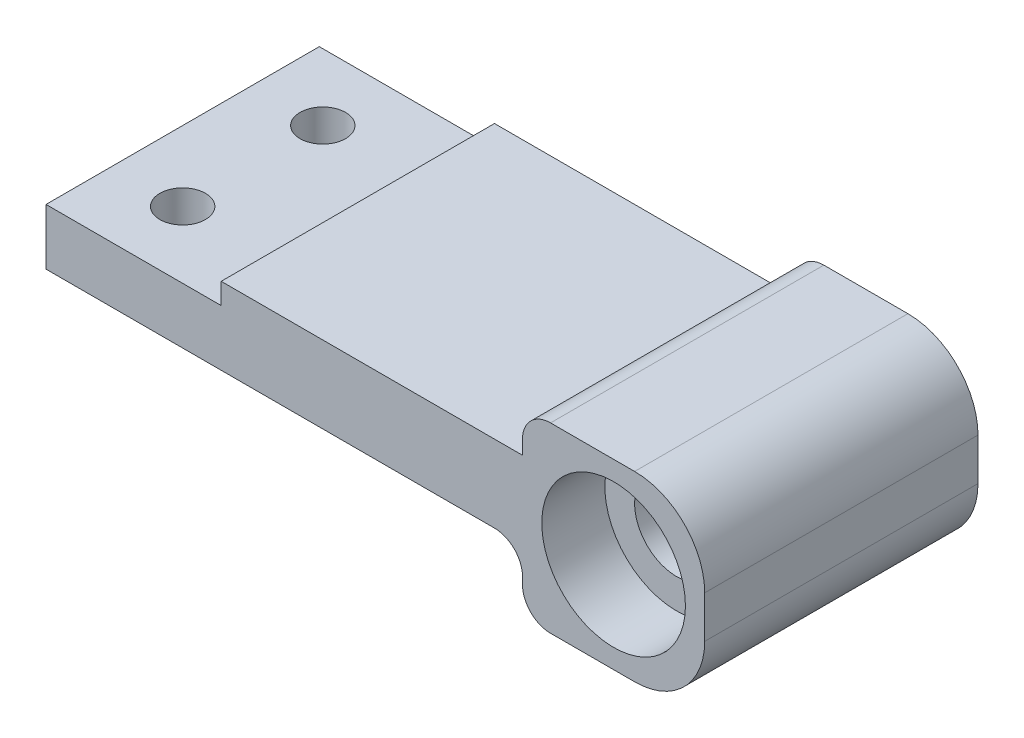
ISO-10303-21;
HEADER;
FILE_DESCRIPTION(('STEP AP214'),'2;1');
FILE_NAME('part.step','',(''),(''),'','','');
FILE_SCHEMA(('AUTOMOTIVE_DESIGN { 1 0 10303 214 1 1 1 1 }'));
ENDSEC;
DATA;
#1=APPLICATION_CONTEXT('core data for automotive mechanical design processes');
#2=APPLICATION_PROTOCOL_DEFINITION('international standard','automotive_design',2000,#1);
#3=PRODUCT_CONTEXT('',#1,'mechanical');
#4=PRODUCT('Part','Part','',(#3));
#5=PRODUCT_RELATED_PRODUCT_CATEGORY('part','',(#4));
#6=PRODUCT_DEFINITION_FORMATION('','',#4);
#7=PRODUCT_DEFINITION_CONTEXT('part definition',#1,'design');
#8=PRODUCT_DEFINITION('design','',#6,#7);
#9=PRODUCT_DEFINITION_SHAPE('','',#8);
#10=(LENGTH_UNIT() NAMED_UNIT(*) SI_UNIT(.MILLI.,.METRE.));
#11=(NAMED_UNIT(*) PLANE_ANGLE_UNIT() SI_UNIT($,.RADIAN.));
#12=(NAMED_UNIT(*) SI_UNIT($,.STERADIAN.) SOLID_ANGLE_UNIT());
#13=UNCERTAINTY_MEASURE_WITH_UNIT(LENGTH_MEASURE(1.E-05),#10,'distance_accuracy_value','');
#14=(GEOMETRIC_REPRESENTATION_CONTEXT(3) GLOBAL_UNCERTAINTY_ASSIGNED_CONTEXT((#13)) GLOBAL_UNIT_ASSIGNED_CONTEXT((#10,
#11,#12)) REPRESENTATION_CONTEXT('',''));
#15=CARTESIAN_POINT('',(0.,0.,0.));
#16=DIRECTION('',(0.,0.,1.));
#17=DIRECTION('',(1.,0.,0.));
#18=AXIS2_PLACEMENT_3D('',#15,#16,#17);
#19=CARTESIAN_POINT('',(-6.5,-2.,53.7344855372474));
#20=DIRECTION('',(0.,-1.,0.));
#21=DIRECTION('',(1.,0.,0.));
#22=AXIS2_PLACEMENT_3D('',#19,#20,#21);
#23=PLANE('',#22);
#24=DIRECTION('',(-1.,0.,0.));
#25=VECTOR('',#24,1.);
#26=CARTESIAN_POINT('',(-6.5,-2.00000000000001,0.));
#27=LINE('',#26,#25);
#28=CARTESIAN_POINT('',(-8.5,-2.,0.));
#29=VERTEX_POINT('',#28);
#30=CARTESIAN_POINT('',(-40.5,-1.99999999999999,0.));
#31=VERTEX_POINT('',#30);
#32=EDGE_CURVE('E192',#29,#31,#27,.T.);
#33=ORIENTED_EDGE('',*,*,#32,.F.);
#34=DIRECTION('',(0.,0.,1.));
#35=VECTOR('',#34,1.);
#36=CARTESIAN_POINT('',(-8.5,-2.,53.7344855372474));
#37=LINE('',#36,#35);
#38=CARTESIAN_POINT('',(-8.5,-2.,19.5));
#39=VERTEX_POINT('',#38);
#40=EDGE_CURVE('E238',#29,#39,#37,.T.);
#41=ORIENTED_EDGE('',*,*,#40,.T.);
#42=DIRECTION('',(-1.,0.,0.));
#43=VECTOR('',#42,1.);
#44=CARTESIAN_POINT('',(-6.5,-2.,19.5));
#45=LINE('',#44,#43);
#46=CARTESIAN_POINT('',(-40.5,-1.99999999999999,19.5));
#47=VERTEX_POINT('',#46);
#48=EDGE_CURVE('E208',#39,#47,#45,.T.);
#49=ORIENTED_EDGE('',*,*,#48,.T.);
#50=DIRECTION('',(0.,0.,-1.));
#51=VECTOR('',#50,1.);
#52=CARTESIAN_POINT('',(-40.5,-1.99999999999998,53.7344855372474));
#53=LINE('',#52,#51);
#54=EDGE_CURVE('E203',#47,#31,#53,.T.);
#55=ORIENTED_EDGE('',*,*,#54,.T.);
#56=EDGE_LOOP('',(#33,#41,#49,#55));
#57=FACE_BOUND('',#56,.T.);
#58=CARTESIAN_POINT('',(-35.5,-1.99999999999999,4.75));
#59=DIRECTION('',(0.,-1.,0.));
#60=DIRECTION('',(1.,0.,0.));
#61=AXIS2_PLACEMENT_3D('',#58,#59,#60);
#62=CIRCLE('',#61,1.625);
#63=CARTESIAN_POINT('',(-33.875,-1.99999999999999,4.75));
#64=VERTEX_POINT('',#63);
#65=EDGE_CURVE('E176',#64,#64,#62,.F.);
#66=ORIENTED_EDGE('',*,*,#65,.T.);
#67=EDGE_LOOP('',(#66));
#68=FACE_BOUND('',#67,.T.);
#69=CARTESIAN_POINT('',(-35.5,-1.99999999999999,14.75));
#70=DIRECTION('',(0.,-1.,0.));
#71=DIRECTION('',(1.,0.,0.));
#72=AXIS2_PLACEMENT_3D('',#69,#70,#71);
#73=CIRCLE('',#72,1.625);
#74=CARTESIAN_POINT('',(-33.875,-1.99999999999999,14.75));
#75=VERTEX_POINT('',#74);
#76=EDGE_CURVE('E166',#75,#75,#73,.F.);
#77=ORIENTED_EDGE('',*,*,#76,.T.);
#78=EDGE_LOOP('',(#77));
#79=FACE_BOUND('',#78,.T.);
#80=CARTESIAN_POINT('',(-19.,-2.,9.74999999999999));
#81=DIRECTION('',(0.,1.,0.));
#82=DIRECTION('',(-1.,0.,0.));
#83=AXIS2_PLACEMENT_3D('',#80,#81,#82);
#84=CIRCLE('',#83,7.75);
#85=CARTESIAN_POINT('',(-26.75,-1.99999999999999,9.74999999999999));
#86=VERTEX_POINT('',#85);
#87=EDGE_CURVE('E334',#86,#86,#84,.T.);
#88=ORIENTED_EDGE('',*,*,#87,.T.);
#89=EDGE_LOOP('',(#88));
#90=FACE_BOUND('',#89,.T.);
#91=ADVANCED_FACE('F35',(#57,#68,#79,#90),#23,.T.);
#92=CARTESIAN_POINT('',(-6.5,2.00000000000002,53.7344855372474));
#93=DIRECTION('',(0.,1.,0.));
#94=DIRECTION('',(0.,0.,1.));
#95=AXIS2_PLACEMENT_3D('',#92,#93,#94);
#96=PLANE('',#95);
#97=CARTESIAN_POINT('',(-35.5,2.00000000000001,4.75));
#98=DIRECTION('',(0.,1.,0.));
#99=DIRECTION('',(0.,0.,1.));
#100=AXIS2_PLACEMENT_3D('',#97,#98,#99);
#101=CIRCLE('',#100,1.625);
#102=CARTESIAN_POINT('',(-35.5,2.00000000000001,6.375));
#103=VERTEX_POINT('',#102);
#104=EDGE_CURVE('E173',#103,#103,#101,.T.);
#105=ORIENTED_EDGE('',*,*,#104,.F.);
#106=EDGE_LOOP('',(#105));
#107=FACE_BOUND('',#106,.T.);
#108=CARTESIAN_POINT('',(-35.5,2.00000000000001,14.75));
#109=DIRECTION('',(0.,1.,0.));
#110=DIRECTION('',(0.,0.,-1.));
#111=AXIS2_PLACEMENT_3D('',#108,#109,#110);
#112=CIRCLE('',#111,1.625);
#113=CARTESIAN_POINT('',(-35.5,2.00000000000001,13.125));
#114=VERTEX_POINT('',#113);
#115=EDGE_CURVE('E162',#114,#114,#112,.T.);
#116=ORIENTED_EDGE('',*,*,#115,.F.);
#117=EDGE_LOOP('',(#116));
#118=FACE_BOUND('',#117,.T.);
#119=DIRECTION('',(1.,0.,0.));
#120=VECTOR('',#119,1.);
#121=CARTESIAN_POINT('',(-6.5,2.00000000000001,19.5));
#122=LINE('',#121,#120);
#123=CARTESIAN_POINT('',(-40.5,2.00000000000002,19.5));
#124=VERTEX_POINT('',#123);
#125=CARTESIAN_POINT('',(-28.,2.00000000000001,19.5));
#126=VERTEX_POINT('',#125);
#127=EDGE_CURVE('E205',#124,#126,#122,.T.);
#128=ORIENTED_EDGE('',*,*,#127,.T.);
#129=DIRECTION('',(0.,0.,1.));
#130=VECTOR('',#129,1.);
#131=CARTESIAN_POINT('',(-28.,2.00000000000001,0.));
#132=LINE('',#131,#130);
#133=CARTESIAN_POINT('',(-28.,2.00000000000001,0.));
#134=VERTEX_POINT('',#133);
#135=EDGE_CURVE('E157',#134,#126,#132,.T.);
#136=ORIENTED_EDGE('',*,*,#135,.F.);
#137=DIRECTION('',(1.,0.,0.));
#138=VECTOR('',#137,1.);
#139=CARTESIAN_POINT('',(-6.5,2.00000000000001,0.));
#140=LINE('',#139,#138);
#141=CARTESIAN_POINT('',(-40.5,2.00000000000001,0.));
#142=VERTEX_POINT('',#141);
#143=EDGE_CURVE('E198',#142,#134,#140,.T.);
#144=ORIENTED_EDGE('',*,*,#143,.F.);
#145=DIRECTION('',(0.,0.,-1.));
#146=VECTOR('',#145,1.);
#147=CARTESIAN_POINT('',(-40.5,2.00000000000002,53.7344855372474));
#148=LINE('',#147,#146);
#149=EDGE_CURVE('E202',#124,#142,#148,.T.);
#150=ORIENTED_EDGE('',*,*,#149,.F.);
#151=EDGE_LOOP('',(#128,#136,#144,#150));
#152=FACE_BOUND('',#151,.T.);
#153=ADVANCED_FACE('F331',(#107,#118,#152),#96,.T.);
#154=CARTESIAN_POINT('',(-8.5,-4.,53.7344855372474));
#155=DIRECTION('',(0.,0.,1.));
#156=DIRECTION('',(0.,-1.,0.));
#157=AXIS2_PLACEMENT_3D('',#154,#155,#156);
#158=CYLINDRICAL_SURFACE('',#157,2.);
#159=ORIENTED_EDGE('',*,*,#40,.F.);
#160=CARTESIAN_POINT('',(-8.5,-4.,0.));
#161=DIRECTION('',(0.,0.,1.));
#162=DIRECTION('',(1.,0.,0.));
#163=AXIS2_PLACEMENT_3D('',#160,#161,#162);
#164=CIRCLE('',#163,2.);
#165=CARTESIAN_POINT('',(-6.5,-4.00000000000001,0.));
#166=VERTEX_POINT('',#165);
#167=EDGE_CURVE('E43',#29,#166,#164,.F.);
#168=ORIENTED_EDGE('',*,*,#167,.T.);
#169=DIRECTION('',(0.,0.,1.));
#170=VECTOR('',#169,1.);
#171=CARTESIAN_POINT('',(-6.5,-4.,19.5));
#172=LINE('',#171,#170);
#173=CARTESIAN_POINT('',(-6.5,-4.,19.5));
#174=VERTEX_POINT('',#173);
#175=EDGE_CURVE('E241',#174,#166,#172,.F.);
#176=ORIENTED_EDGE('',*,*,#175,.F.);
#177=CARTESIAN_POINT('',(-8.5,-4.,19.5));
#178=DIRECTION('',(0.,0.,1.));
#179=DIRECTION('',(1.,0.,0.));
#180=AXIS2_PLACEMENT_3D('',#177,#178,#179);
#181=CIRCLE('',#180,2.);
#182=EDGE_CURVE('E12',#174,#39,#181,.T.);
#183=ORIENTED_EDGE('',*,*,#182,.T.);
#184=EDGE_LOOP('',(#159,#168,#176,#183));
#185=FACE_BOUND('',#184,.T.);
#186=ADVANCED_FACE('F37',(#185),#158,.F.);
#187=CARTESIAN_POINT('',(-4.5,-4.5,19.5));
#188=DIRECTION('',(0.,0.,-1.));
#189=DIRECTION('',(-1.,0.,0.));
#190=AXIS2_PLACEMENT_3D('',#187,#188,#189);
#191=CYLINDRICAL_SURFACE('',#190,2.);
#192=DIRECTION('',(0.,0.,-1.));
#193=VECTOR('',#192,1.);
#194=CARTESIAN_POINT('',(-4.5,-6.5,19.5));
#195=LINE('',#194,#193);
#196=CARTESIAN_POINT('',(-4.5,-6.5,19.5));
#197=VERTEX_POINT('',#196);
#198=CARTESIAN_POINT('',(-4.5,-6.5,0.));
#199=VERTEX_POINT('',#198);
#200=EDGE_CURVE('E299',#197,#199,#195,.T.);
#201=ORIENTED_EDGE('',*,*,#200,.F.);
#202=CARTESIAN_POINT('',(-4.5,-4.5,19.5));
#203=DIRECTION('',(0.,0.,1.));
#204=DIRECTION('',(1.,0.,0.));
#205=AXIS2_PLACEMENT_3D('',#202,#203,#204);
#206=CIRCLE('',#205,2.);
#207=CARTESIAN_POINT('',(-6.5,-4.5,19.5));
#208=VERTEX_POINT('',#207);
#209=EDGE_CURVE('E307',#208,#197,#206,.T.);
#210=ORIENTED_EDGE('',*,*,#209,.F.);
#211=DIRECTION('',(0.,0.,-1.));
#212=VECTOR('',#211,1.);
#213=CARTESIAN_POINT('',(-6.5,-4.5,19.5));
#214=LINE('',#213,#212);
#215=CARTESIAN_POINT('',(-6.5,-4.5,0.));
#216=VERTEX_POINT('',#215);
#217=EDGE_CURVE('E304',#216,#208,#214,.F.);
#218=ORIENTED_EDGE('',*,*,#217,.F.);
#219=CARTESIAN_POINT('',(-4.5,-4.5,0.));
#220=DIRECTION('',(0.,0.,1.));
#221=DIRECTION('',(1.,0.,0.));
#222=AXIS2_PLACEMENT_3D('',#219,#220,#221);
#223=CIRCLE('',#222,2.);
#224=EDGE_CURVE('E242',#199,#216,#223,.F.);
#225=ORIENTED_EDGE('',*,*,#224,.F.);
#226=EDGE_LOOP('',(#201,#210,#218,#225));
#227=FACE_BOUND('',#226,.T.);
#228=ADVANCED_FACE('F316',(#227),#191,.T.);
#229=CARTESIAN_POINT('',(-4.5,4.5,19.5));
#230=DIRECTION('',(0.,0.,1.));
#231=DIRECTION('',(1.,0.,0.));
#232=AXIS2_PLACEMENT_3D('',#229,#230,#231);
#233=CYLINDRICAL_SURFACE('',#232,2.);
#234=DIRECTION('',(0.,0.,1.));
#235=VECTOR('',#234,1.);
#236=CARTESIAN_POINT('',(-4.5,6.5,19.5));
#237=LINE('',#236,#235);
#238=CARTESIAN_POINT('',(-4.5,6.5,0.));
#239=VERTEX_POINT('',#238);
#240=CARTESIAN_POINT('',(-4.5,6.5,19.5));
#241=VERTEX_POINT('',#240);
#242=EDGE_CURVE('E221',#239,#241,#237,.T.);
#243=ORIENTED_EDGE('',*,*,#242,.F.);
#244=CARTESIAN_POINT('',(-4.5,4.5,0.));
#245=DIRECTION('',(0.,0.,1.));
#246=DIRECTION('',(1.,0.,0.));
#247=AXIS2_PLACEMENT_3D('',#244,#245,#246);
#248=CIRCLE('',#247,2.);
#249=CARTESIAN_POINT('',(-6.5,4.5,0.));
#250=VERTEX_POINT('',#249);
#251=EDGE_CURVE('E293',#250,#239,#248,.F.);
#252=ORIENTED_EDGE('',*,*,#251,.F.);
#253=DIRECTION('',(0.,0.,1.));
#254=VECTOR('',#253,1.);
#255=CARTESIAN_POINT('',(-6.5,4.5,19.5));
#256=LINE('',#255,#254);
#257=CARTESIAN_POINT('',(-6.5,4.5,19.5));
#258=VERTEX_POINT('',#257);
#259=EDGE_CURVE('E229',#258,#250,#256,.F.);
#260=ORIENTED_EDGE('',*,*,#259,.F.);
#261=CARTESIAN_POINT('',(-4.5,4.5,19.5));
#262=DIRECTION('',(0.,0.,1.));
#263=DIRECTION('',(1.,0.,0.));
#264=AXIS2_PLACEMENT_3D('',#261,#262,#263);
#265=CIRCLE('',#264,2.);
#266=EDGE_CURVE('E297',#241,#258,#265,.T.);
#267=ORIENTED_EDGE('',*,*,#266,.F.);
#268=EDGE_LOOP('',(#243,#252,#260,#267));
#269=FACE_BOUND('',#268,.T.);
#270=ADVANCED_FACE('F390',(#269),#233,.T.);
#271=CARTESIAN_POINT('',(1.5,-1.5,19.5));
#272=DIRECTION('',(0.,0.,-1.));
#273=DIRECTION('',(-1.,0.,0.));
#274=AXIS2_PLACEMENT_3D('',#271,#272,#273);
#275=CYLINDRICAL_SURFACE('',#274,5.);
#276=DIRECTION('',(0.,0.,-1.));
#277=VECTOR('',#276,1.);
#278=CARTESIAN_POINT('',(6.5,-1.5,19.5));
#279=LINE('',#278,#277);
#280=CARTESIAN_POINT('',(6.5,-1.5,19.5));
#281=VERTEX_POINT('',#280);
#282=CARTESIAN_POINT('',(6.5,-1.5,0.));
#283=VERTEX_POINT('',#282);
#284=EDGE_CURVE('E273',#281,#283,#279,.T.);
#285=ORIENTED_EDGE('',*,*,#284,.F.);
#286=CARTESIAN_POINT('',(1.5,-1.5,19.5));
#287=DIRECTION('',(0.,0.,1.));
#288=DIRECTION('',(1.,0.,0.));
#289=AXIS2_PLACEMENT_3D('',#286,#287,#288);
#290=CIRCLE('',#289,5.);
#291=CARTESIAN_POINT('',(1.5,-6.5,19.5));
#292=VERTEX_POINT('',#291);
#293=EDGE_CURVE('E279',#292,#281,#290,.T.);
#294=ORIENTED_EDGE('',*,*,#293,.F.);
#295=DIRECTION('',(0.,0.,-1.));
#296=VECTOR('',#295,1.);
#297=CARTESIAN_POINT('',(1.5,-6.5,19.5));
#298=LINE('',#297,#296);
#299=CARTESIAN_POINT('',(1.5,-6.5,0.));
#300=VERTEX_POINT('',#299);
#301=EDGE_CURVE('E276',#300,#292,#298,.F.);
#302=ORIENTED_EDGE('',*,*,#301,.F.);
#303=CARTESIAN_POINT('',(1.5,-1.5,0.));
#304=DIRECTION('',(0.,0.,1.));
#305=DIRECTION('',(1.,0.,0.));
#306=AXIS2_PLACEMENT_3D('',#303,#304,#305);
#307=CIRCLE('',#306,5.);
#308=EDGE_CURVE('E280',#283,#300,#307,.F.);
#309=ORIENTED_EDGE('',*,*,#308,.F.);
#310=EDGE_LOOP('',(#285,#294,#302,#309));
#311=FACE_BOUND('',#310,.T.);
#312=ADVANCED_FACE('F386',(#311),#275,.T.);
#313=CARTESIAN_POINT('',(1.5,1.5,19.5));
#314=DIRECTION('',(0.,0.,-1.));
#315=DIRECTION('',(-1.,0.,0.));
#316=AXIS2_PLACEMENT_3D('',#313,#314,#315);
#317=CYLINDRICAL_SURFACE('',#316,5.);
#318=DIRECTION('',(0.,0.,-1.));
#319=VECTOR('',#318,1.);
#320=CARTESIAN_POINT('',(1.5,6.5,19.5));
#321=LINE('',#320,#319);
#322=CARTESIAN_POINT('',(1.5,6.5,19.5));
#323=VERTEX_POINT('',#322);
#324=CARTESIAN_POINT('',(1.5,6.5,0.));
#325=VERTEX_POINT('',#324);
#326=EDGE_CURVE('E262',#323,#325,#321,.T.);
#327=ORIENTED_EDGE('',*,*,#326,.F.);
#328=CARTESIAN_POINT('',(1.5,1.5,19.5));
#329=DIRECTION('',(0.,0.,1.));
#330=DIRECTION('',(1.,0.,0.));
#331=AXIS2_PLACEMENT_3D('',#328,#329,#330);
#332=CIRCLE('',#331,5.);
#333=CARTESIAN_POINT('',(6.5,1.5,19.5));
#334=VERTEX_POINT('',#333);
#335=EDGE_CURVE('E268',#334,#323,#332,.T.);
#336=ORIENTED_EDGE('',*,*,#335,.F.);
#337=DIRECTION('',(0.,0.,-1.));
#338=VECTOR('',#337,1.);
#339=CARTESIAN_POINT('',(6.5,1.5,19.5));
#340=LINE('',#339,#338);
#341=CARTESIAN_POINT('',(6.5,1.5,0.));
#342=VERTEX_POINT('',#341);
#343=EDGE_CURVE('E265',#342,#334,#340,.F.);
#344=ORIENTED_EDGE('',*,*,#343,.F.);
#345=CARTESIAN_POINT('',(1.5,1.5,0.));
#346=DIRECTION('',(0.,0.,1.));
#347=DIRECTION('',(1.,0.,0.));
#348=AXIS2_PLACEMENT_3D('',#345,#346,#347);
#349=CIRCLE('',#348,5.);
#350=EDGE_CURVE('E270',#325,#342,#349,.F.);
#351=ORIENTED_EDGE('',*,*,#350,.F.);
#352=EDGE_LOOP('',(#327,#336,#344,#351));
#353=FACE_BOUND('',#352,.T.);
#354=ADVANCED_FACE('F382',(#353),#317,.T.);
#355=CARTESIAN_POINT('',(0.,0.,-3.48528137423857));
#356=DIRECTION('',(0.,0.,1.));
#357=DIRECTION('',(1.,0.,0.));
#358=AXIS2_PLACEMENT_3D('',#355,#356,#357);
#359=CYLINDRICAL_SURFACE('',#358,3.);
#360=CARTESIAN_POINT('',(0.,0.,15.));
#361=DIRECTION('',(0.,0.,1.));
#362=DIRECTION('',(1.,0.,0.));
#363=AXIS2_PLACEMENT_3D('',#360,#361,#362);
#364=CIRCLE('',#363,3.);
#365=CARTESIAN_POINT('',(3.,0.,15.));
#366=VERTEX_POINT('',#365);
#367=EDGE_CURVE('E179',#366,#366,#364,.T.);
#368=ORIENTED_EDGE('',*,*,#367,.T.);
#369=EDGE_LOOP('',(#368));
#370=FACE_BOUND('',#369,.T.);
#371=CARTESIAN_POINT('',(0.,0.,5.25));
#372=DIRECTION('',(0.,0.,-1.));
#373=DIRECTION('',(0.,1.,0.));
#374=AXIS2_PLACEMENT_3D('',#371,#372,#373);
#375=CIRCLE('',#374,3.);
#376=CARTESIAN_POINT('',(0.,3.,5.25));
#377=VERTEX_POINT('',#376);
#378=EDGE_CURVE('E259',#377,#377,#375,.F.);
#379=ORIENTED_EDGE('',*,*,#378,.F.);
#380=EDGE_LOOP('',(#379));
#381=FACE_BOUND('',#380,.T.);
#382=ADVANCED_FACE('F385',(#370,#381),#359,.F.);
#383=CARTESIAN_POINT('',(-6.5,-6.5,19.5));
#384=DIRECTION('',(1.,0.,0.));
#385=DIRECTION('',(0.,0.,-1.));
#386=AXIS2_PLACEMENT_3D('',#383,#384,#385);
#387=PLANE('',#386);
#388=DIRECTION('',(0.,-1.,0.));
#389=VECTOR('',#388,1.);
#390=CARTESIAN_POINT('',(-6.5,-6.5,0.));
#391=LINE('',#390,#389);
#392=CARTESIAN_POINT('',(-6.5,3.50000000000001,0.));
#393=VERTEX_POINT('',#392);
#394=EDGE_CURVE('E223',#250,#393,#391,.T.);
#395=ORIENTED_EDGE('',*,*,#394,.T.);
#396=DIRECTION('',(0.,0.,-1.));
#397=VECTOR('',#396,1.);
#398=CARTESIAN_POINT('',(-6.5,3.50000000000001,0.));
#399=LINE('',#398,#397);
#400=CARTESIAN_POINT('',(-6.5,3.50000000000001,19.5));
#401=VERTEX_POINT('',#400);
#402=EDGE_CURVE('E148',#401,#393,#399,.T.);
#403=ORIENTED_EDGE('',*,*,#402,.F.);
#404=DIRECTION('',(0.,-1.,0.));
#405=VECTOR('',#404,1.);
#406=CARTESIAN_POINT('',(-6.5,-6.5,19.5));
#407=LINE('',#406,#405);
#408=EDGE_CURVE('E145',#258,#401,#407,.T.);
#409=ORIENTED_EDGE('',*,*,#408,.F.);
#410=ORIENTED_EDGE('',*,*,#259,.T.);
#411=EDGE_LOOP('',(#395,#403,#409,#410));
#412=FACE_BOUND('',#411,.T.);
#413=ADVANCED_FACE('F381',(#412),#387,.F.);
#414=EDGE_CURVE('E215',#174,#208,#407,.T.);
#415=ORIENTED_EDGE('',*,*,#414,.F.);
#416=ORIENTED_EDGE('',*,*,#175,.T.);
#417=EDGE_CURVE('E228',#166,#216,#391,.T.);
#418=ORIENTED_EDGE('',*,*,#417,.T.);
#419=ORIENTED_EDGE('',*,*,#217,.T.);
#420=EDGE_LOOP('',(#415,#416,#418,#419));
#421=FACE_BOUND('',#420,.T.);
#422=ADVANCED_FACE('F319',(#421),#387,.F.);
#423=CARTESIAN_POINT('',(6.5,-6.5,19.5));
#424=DIRECTION('',(0.,1.,0.));
#425=DIRECTION('',(-1.,0.,0.));
#426=AXIS2_PLACEMENT_3D('',#423,#424,#425);
#427=PLANE('',#426);
#428=DIRECTION('',(1.,0.,0.));
#429=VECTOR('',#428,1.);
#430=CARTESIAN_POINT('',(6.5,-6.5,19.5));
#431=LINE('',#430,#429);
#432=EDGE_CURVE('E211',#197,#292,#431,.T.);
#433=ORIENTED_EDGE('',*,*,#432,.F.);
#434=ORIENTED_EDGE('',*,*,#200,.T.);
#435=DIRECTION('',(1.,0.,0.));
#436=VECTOR('',#435,1.);
#437=CARTESIAN_POINT('',(6.5,-6.5,0.));
#438=LINE('',#437,#436);
#439=EDGE_CURVE('E227',#199,#300,#438,.T.);
#440=ORIENTED_EDGE('',*,*,#439,.T.);
#441=ORIENTED_EDGE('',*,*,#301,.T.);
#442=EDGE_LOOP('',(#433,#434,#440,#441));
#443=FACE_BOUND('',#442,.T.);
#444=ADVANCED_FACE('F374',(#443),#427,.F.);
#445=CARTESIAN_POINT('',(6.5,-6.5,19.5));
#446=DIRECTION('',(-1.,0.,0.));
#447=DIRECTION('',(0.,0.,1.));
#448=AXIS2_PLACEMENT_3D('',#445,#446,#447);
#449=PLANE('',#448);
#450=DIRECTION('',(0.,1.,0.));
#451=VECTOR('',#450,1.);
#452=CARTESIAN_POINT('',(6.5,-6.5,19.5));
#453=LINE('',#452,#451);
#454=EDGE_CURVE('E627',#281,#334,#453,.T.);
#455=ORIENTED_EDGE('',*,*,#454,.F.);
#456=ORIENTED_EDGE('',*,*,#284,.T.);
#457=DIRECTION('',(0.,1.,0.));
#458=VECTOR('',#457,1.);
#459=CARTESIAN_POINT('',(6.5,-6.5,0.));
#460=LINE('',#459,#458);
#461=EDGE_CURVE('E624',#283,#342,#460,.T.);
#462=ORIENTED_EDGE('',*,*,#461,.T.);
#463=ORIENTED_EDGE('',*,*,#343,.T.);
#464=EDGE_LOOP('',(#455,#456,#462,#463));
#465=FACE_BOUND('',#464,.T.);
#466=ADVANCED_FACE('F371',(#465),#449,.F.);
#467=CARTESIAN_POINT('',(6.5,6.5,19.5));
#468=DIRECTION('',(0.,-1.,0.));
#469=DIRECTION('',(1.,0.,0.));
#470=AXIS2_PLACEMENT_3D('',#467,#468,#469);
#471=PLANE('',#470);
#472=DIRECTION('',(-1.,0.,0.));
#473=VECTOR('',#472,1.);
#474=CARTESIAN_POINT('',(6.5,6.5,0.));
#475=LINE('',#474,#473);
#476=EDGE_CURVE('E249',#325,#239,#475,.T.);
#477=ORIENTED_EDGE('',*,*,#476,.T.);
#478=ORIENTED_EDGE('',*,*,#242,.T.);
#479=DIRECTION('',(-1.,0.,0.));
#480=VECTOR('',#479,1.);
#481=CARTESIAN_POINT('',(6.5,6.5,19.5));
#482=LINE('',#481,#480);
#483=EDGE_CURVE('E234',#323,#241,#482,.T.);
#484=ORIENTED_EDGE('',*,*,#483,.F.);
#485=ORIENTED_EDGE('',*,*,#326,.T.);
#486=EDGE_LOOP('',(#477,#478,#484,#485));
#487=FACE_BOUND('',#486,.T.);
#488=ADVANCED_FACE('F366',(#487),#471,.F.);
#489=CARTESIAN_POINT('',(0.,0.,19.5));
#490=DIRECTION('',(0.,0.,1.));
#491=DIRECTION('',(1.,0.,0.));
#492=AXIS2_PLACEMENT_3D('',#489,#490,#491);
#493=PLANE('',#492);
#494=ORIENTED_EDGE('',*,*,#182,.F.);
#495=ORIENTED_EDGE('',*,*,#414,.T.);
#496=ORIENTED_EDGE('',*,*,#209,.T.);
#497=ORIENTED_EDGE('',*,*,#432,.T.);
#498=ORIENTED_EDGE('',*,*,#293,.T.);
#499=ORIENTED_EDGE('',*,*,#454,.T.);
#500=ORIENTED_EDGE('',*,*,#335,.T.);
#501=ORIENTED_EDGE('',*,*,#483,.T.);
#502=ORIENTED_EDGE('',*,*,#266,.T.);
#503=ORIENTED_EDGE('',*,*,#408,.T.);
#504=DIRECTION('',(1.,0.,0.));
#505=VECTOR('',#504,1.);
#506=CARTESIAN_POINT('',(-28.,3.50000000000001,19.5));
#507=LINE('',#506,#505);
#508=CARTESIAN_POINT('',(-28.,3.50000000000001,19.5));
#509=VERTEX_POINT('',#508);
#510=EDGE_CURVE('E137',#509,#401,#507,.T.);
#511=ORIENTED_EDGE('',*,*,#510,.F.);
#512=DIRECTION('',(0.,-1.,0.));
#513=VECTOR('',#512,1.);
#514=CARTESIAN_POINT('',(-28.,3.50000000000001,19.5));
#515=LINE('',#514,#513);
#516=EDGE_CURVE('E142',#509,#126,#515,.T.);
#517=ORIENTED_EDGE('',*,*,#516,.T.);
#518=ORIENTED_EDGE('',*,*,#127,.F.);
#519=DIRECTION('',(0.,1.,0.));
#520=VECTOR('',#519,1.);
#521=CARTESIAN_POINT('',(-40.5,2.00000000000002,19.5));
#522=LINE('',#521,#520);
#523=EDGE_CURVE('E199',#47,#124,#522,.T.);
#524=ORIENTED_EDGE('',*,*,#523,.F.);
#525=ORIENTED_EDGE('',*,*,#48,.F.);
#526=EDGE_LOOP('',(#494,#495,#496,#497,#498,#499,#500,#501,#502,#503,#511,#517,#518,#524,#525));
#527=FACE_BOUND('',#526,.T.);
#528=CARTESIAN_POINT('',(0.,0.,19.5));
#529=DIRECTION('',(0.,0.,1.));
#530=DIRECTION('',(1.,0.,0.));
#531=AXIS2_PLACEMENT_3D('',#528,#529,#530);
#532=CIRCLE('',#531,5.125);
#533=CARTESIAN_POINT('',(5.125,0.,19.5));
#534=VERTEX_POINT('',#533);
#535=EDGE_CURVE('E186',#534,#534,#532,.T.);
#536=ORIENTED_EDGE('',*,*,#535,.F.);
#537=EDGE_LOOP('',(#536));
#538=FACE_BOUND('',#537,.T.);
#539=ADVANCED_FACE('F139',(#527,#538),#493,.T.);
#540=CARTESIAN_POINT('',(0.,0.,0.));
#541=DIRECTION('',(0.,0.,1.));
#542=DIRECTION('',(1.,0.,0.));
#543=AXIS2_PLACEMENT_3D('',#540,#541,#542);
#544=PLANE('',#543);
#545=ORIENTED_EDGE('',*,*,#167,.F.);
#546=ORIENTED_EDGE('',*,*,#32,.T.);
#547=DIRECTION('',(0.,1.,0.));
#548=VECTOR('',#547,1.);
#549=CARTESIAN_POINT('',(-40.5,2.00000000000001,0.));
#550=LINE('',#549,#548);
#551=EDGE_CURVE('E195',#31,#142,#550,.T.);
#552=ORIENTED_EDGE('',*,*,#551,.T.);
#553=ORIENTED_EDGE('',*,*,#143,.T.);
#554=DIRECTION('',(0.,-1.,0.));
#555=VECTOR('',#554,1.);
#556=CARTESIAN_POINT('',(-28.,3.50000000000001,0.));
#557=LINE('',#556,#555);
#558=CARTESIAN_POINT('',(-28.,3.50000000000001,0.));
#559=VERTEX_POINT('',#558);
#560=EDGE_CURVE('E163',#559,#134,#557,.T.);
#561=ORIENTED_EDGE('',*,*,#560,.F.);
#562=DIRECTION('',(-1.,0.,0.));
#563=VECTOR('',#562,1.);
#564=CARTESIAN_POINT('',(-28.,3.50000000000001,0.));
#565=LINE('',#564,#563);
#566=EDGE_CURVE('E154',#393,#559,#565,.T.);
#567=ORIENTED_EDGE('',*,*,#566,.F.);
#568=ORIENTED_EDGE('',*,*,#394,.F.);
#569=ORIENTED_EDGE('',*,*,#251,.T.);
#570=ORIENTED_EDGE('',*,*,#476,.F.);
#571=ORIENTED_EDGE('',*,*,#350,.T.);
#572=ORIENTED_EDGE('',*,*,#461,.F.);
#573=ORIENTED_EDGE('',*,*,#308,.T.);
#574=ORIENTED_EDGE('',*,*,#439,.F.);
#575=ORIENTED_EDGE('',*,*,#224,.T.);
#576=ORIENTED_EDGE('',*,*,#417,.F.);
#577=EDGE_LOOP('',(#545,#546,#552,#553,#561,#567,#568,#569,#570,#571,#572,#573,#574,#575,#576));
#578=FACE_BOUND('',#577,.T.);
#579=CARTESIAN_POINT('',(0.,0.,0.));
#580=DIRECTION('',(0.,0.,-1.));
#581=DIRECTION('',(0.,1.,0.));
#582=AXIS2_PLACEMENT_3D('',#579,#580,#581);
#583=CIRCLE('',#582,5.125);
#584=CARTESIAN_POINT('',(0.,5.125,0.));
#585=VERTEX_POINT('',#584);
#586=EDGE_CURVE('E182',#585,#585,#583,.T.);
#587=ORIENTED_EDGE('',*,*,#586,.F.);
#588=EDGE_LOOP('',(#587));
#589=FACE_BOUND('',#588,.T.);
#590=ADVANCED_FACE('F311',(#578,#589),#544,.F.);
#591=CARTESIAN_POINT('',(-40.5,2.00000000000002,53.7344855372474));
#592=DIRECTION('',(-1.,0.,0.));
#593=DIRECTION('',(0.,0.,1.));
#594=AXIS2_PLACEMENT_3D('',#591,#592,#593);
#595=PLANE('',#594);
#596=ORIENTED_EDGE('',*,*,#54,.F.);
#597=ORIENTED_EDGE('',*,*,#523,.T.);
#598=ORIENTED_EDGE('',*,*,#149,.T.);
#599=ORIENTED_EDGE('',*,*,#551,.F.);
#600=EDGE_LOOP('',(#596,#597,#598,#599));
#601=FACE_BOUND('',#600,.T.);
#602=ADVANCED_FACE('F328',(#601),#595,.T.);
#603=CARTESIAN_POINT('',(0.,0.,15.));
#604=DIRECTION('',(0.,0.,1.));
#605=DIRECTION('',(1.,0.,0.));
#606=AXIS2_PLACEMENT_3D('',#603,#604,#605);
#607=CYLINDRICAL_SURFACE('',#606,5.125);
#608=CARTESIAN_POINT('',(0.,0.,15.));
#609=DIRECTION('',(0.,0.,1.));
#610=DIRECTION('',(1.,0.,0.));
#611=AXIS2_PLACEMENT_3D('',#608,#609,#610);
#612=CIRCLE('',#611,5.125);
#613=CARTESIAN_POINT('',(5.125,0.,15.));
#614=VERTEX_POINT('',#613);
#615=EDGE_CURVE('E189',#614,#614,#612,.T.);
#616=ORIENTED_EDGE('',*,*,#615,.F.);
#617=EDGE_LOOP('',(#616));
#618=FACE_BOUND('',#617,.T.);
#619=ORIENTED_EDGE('',*,*,#535,.T.);
#620=EDGE_LOOP('',(#619));
#621=FACE_BOUND('',#620,.T.);
#622=ADVANCED_FACE('F493',(#618,#621),#607,.F.);
#623=CARTESIAN_POINT('',(0.,0.,15.));
#624=DIRECTION('',(0.,0.,1.));
#625=DIRECTION('',(1.,0.,0.));
#626=AXIS2_PLACEMENT_3D('',#623,#624,#625);
#627=PLANE('',#626);
#628=ORIENTED_EDGE('',*,*,#367,.F.);
#629=EDGE_LOOP('',(#628));
#630=FACE_BOUND('',#629,.T.);
#631=ORIENTED_EDGE('',*,*,#615,.T.);
#632=EDGE_LOOP('',(#631));
#633=FACE_BOUND('',#632,.T.);
#634=ADVANCED_FACE('F489',(#630,#633),#627,.T.);
#635=CARTESIAN_POINT('',(0.,0.,5.));
#636=DIRECTION('',(0.,0.,-1.));
#637=DIRECTION('',(0.,1.,0.));
#638=AXIS2_PLACEMENT_3D('',#635,#636,#637);
#639=CYLINDRICAL_SURFACE('',#638,5.125);
#640=CARTESIAN_POINT('',(0.,0.,5.));
#641=DIRECTION('',(0.,0.,-1.));
#642=DIRECTION('',(0.,1.,0.));
#643=AXIS2_PLACEMENT_3D('',#640,#641,#642);
#644=CIRCLE('',#643,5.125);
#645=CARTESIAN_POINT('',(0.,5.125,5.));
#646=VERTEX_POINT('',#645);
#647=EDGE_CURVE('E183',#646,#646,#644,.T.);
#648=ORIENTED_EDGE('',*,*,#647,.F.);
#649=EDGE_LOOP('',(#648));
#650=FACE_BOUND('',#649,.T.);
#651=ORIENTED_EDGE('',*,*,#586,.T.);
#652=EDGE_LOOP('',(#651));
#653=FACE_BOUND('',#652,.T.);
#654=ADVANCED_FACE('F485',(#650,#653),#639,.F.);
#655=CARTESIAN_POINT('',(0.,0.,5.));
#656=DIRECTION('',(0.,0.,-1.));
#657=DIRECTION('',(0.,1.,0.));
#658=AXIS2_PLACEMENT_3D('',#655,#656,#657);
#659=PLANE('',#658);
#660=ORIENTED_EDGE('',*,*,#647,.T.);
#661=EDGE_LOOP('',(#660));
#662=FACE_BOUND('',#661,.T.);
#663=ADVANCED_FACE('F479',(#662),#659,.T.);
#664=CARTESIAN_POINT('',(0.,0.,5.25));
#665=DIRECTION('',(0.,0.,-1.));
#666=DIRECTION('',(0.,1.,0.));
#667=AXIS2_PLACEMENT_3D('',#664,#665,#666);
#668=PLANE('',#667);
#669=ORIENTED_EDGE('',*,*,#378,.T.);
#670=EDGE_LOOP('',(#669));
#671=FACE_BOUND('',#670,.T.);
#672=ADVANCED_FACE('F475',(#671),#668,.F.);
#673=CARTESIAN_POINT('',(-35.5,-6.59619407771256,4.75));
#674=DIRECTION('',(0.,1.,0.));
#675=DIRECTION('',(0.,0.,1.));
#676=AXIS2_PLACEMENT_3D('',#673,#674,#675);
#677=CYLINDRICAL_SURFACE('',#676,1.625);
#678=ORIENTED_EDGE('',*,*,#104,.T.);
#679=EDGE_LOOP('',(#678));
#680=FACE_BOUND('',#679,.T.);
#681=ORIENTED_EDGE('',*,*,#65,.F.);
#682=EDGE_LOOP('',(#681));
#683=FACE_BOUND('',#682,.T.);
#684=ADVANCED_FACE('F471',(#680,#683),#677,.F.);
#685=CARTESIAN_POINT('',(-35.5,-6.59619407771256,14.75));
#686=DIRECTION('',(0.,1.,0.));
#687=DIRECTION('',(0.,0.,1.));
#688=AXIS2_PLACEMENT_3D('',#685,#686,#687);
#689=CYLINDRICAL_SURFACE('',#688,1.625);
#690=ORIENTED_EDGE('',*,*,#115,.T.);
#691=EDGE_LOOP('',(#690));
#692=FACE_BOUND('',#691,.T.);
#693=ORIENTED_EDGE('',*,*,#76,.F.);
#694=EDGE_LOOP('',(#693));
#695=FACE_BOUND('',#694,.T.);
#696=ADVANCED_FACE('F414',(#692,#695),#689,.F.);
#697=CARTESIAN_POINT('',(-28.,3.50000000000001,0.));
#698=DIRECTION('',(1.,0.,0.));
#699=DIRECTION('',(0.,1.,0.));
#700=AXIS2_PLACEMENT_3D('',#697,#698,#699);
#701=PLANE('',#700);
#702=ORIENTED_EDGE('',*,*,#135,.T.);
#703=ORIENTED_EDGE('',*,*,#516,.F.);
#704=DIRECTION('',(0.,0.,1.));
#705=VECTOR('',#704,1.);
#706=CARTESIAN_POINT('',(-28.,3.50000000000001,0.));
#707=LINE('',#706,#705);
#708=EDGE_CURVE('E149',#559,#509,#707,.T.);
#709=ORIENTED_EDGE('',*,*,#708,.F.);
#710=ORIENTED_EDGE('',*,*,#560,.T.);
#711=EDGE_LOOP('',(#702,#703,#709,#710));
#712=FACE_BOUND('',#711,.T.);
#713=ADVANCED_FACE('F159',(#712),#701,.F.);
#714=CARTESIAN_POINT('',(0.,3.50000000000001,0.));
#715=DIRECTION('',(0.,1.,0.));
#716=DIRECTION('',(0.,0.,1.));
#717=AXIS2_PLACEMENT_3D('',#714,#715,#716);
#718=PLANE('',#717);
#719=ORIENTED_EDGE('',*,*,#708,.T.);
#720=ORIENTED_EDGE('',*,*,#510,.T.);
#721=ORIENTED_EDGE('',*,*,#402,.T.);
#722=ORIENTED_EDGE('',*,*,#566,.T.);
#723=EDGE_LOOP('',(#719,#720,#721,#722));
#724=FACE_BOUND('',#723,.T.);
#725=ADVANCED_FACE('F152',(#724),#718,.T.);
#726=CARTESIAN_POINT('',(-19.,25.420310216783,9.74999999999999));
#727=DIRECTION('',(0.,-1.,0.));
#728=DIRECTION('',(1.,0.,0.));
#729=AXIS2_PLACEMENT_3D('',#726,#727,#728);
#730=CYLINDRICAL_SURFACE('',#729,7.75);
#731=ORIENTED_EDGE('',*,*,#87,.F.);
#732=EDGE_LOOP('',(#731));
#733=FACE_BOUND('',#732,.T.);
#734=CARTESIAN_POINT('',(-19.,1.75000000000001,9.74999999999999));
#735=DIRECTION('',(0.,1.,0.));
#736=DIRECTION('',(0.,0.,1.));
#737=AXIS2_PLACEMENT_3D('',#734,#735,#736);
#738=CIRCLE('',#737,7.75);
#739=CARTESIAN_POINT('',(-19.,1.75000000000001,17.5));
#740=VERTEX_POINT('',#739);
#741=EDGE_CURVE('E332',#740,#740,#738,.T.);
#742=ORIENTED_EDGE('',*,*,#741,.T.);
#743=EDGE_LOOP('',(#742));
#744=FACE_BOUND('',#743,.T.);
#745=ADVANCED_FACE('F343',(#733,#744),#730,.F.);
#746=CARTESIAN_POINT('',(0.,1.75000000000001,0.));
#747=DIRECTION('',(0.,1.,0.));
#748=DIRECTION('',(0.,0.,1.));
#749=AXIS2_PLACEMENT_3D('',#746,#747,#748);
#750=PLANE('',#749);
#751=ORIENTED_EDGE('',*,*,#741,.F.);
#752=EDGE_LOOP('',(#751));
#753=FACE_BOUND('',#752,.T.);
#754=ADVANCED_FACE('F346',(#753),#750,.F.);
#755=CLOSED_SHELL('',(#91,#153,#186,#228,#270,#312,#354,#382,#413,#422,#444,#466,#488,#539,#590,
#602,#622,#634,#654,#663,#672,#684,#696,#713,#725,#745,#754));
#756=MANIFOLD_SOLID_BREP('B2',#755);
#757=ADVANCED_BREP_SHAPE_REPRESENTATION('',(#18,#756),#14);
#758=SHAPE_DEFINITION_REPRESENTATION(#9,#757);
ENDSEC;
END-ISO-10303-21;
